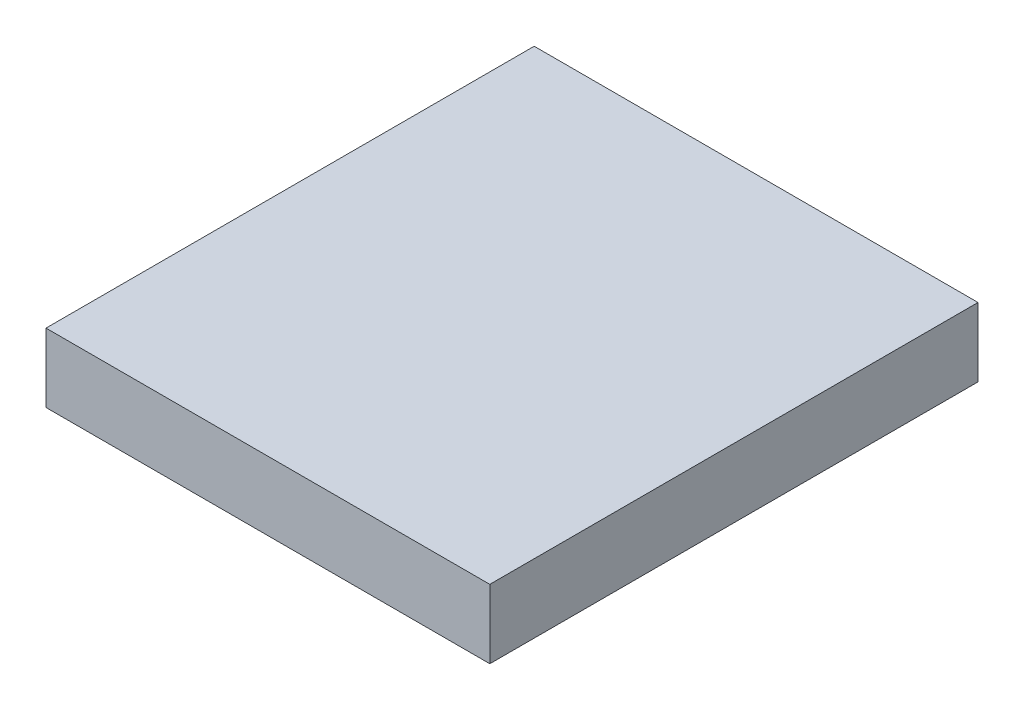
ISO-10303-21;
HEADER;
FILE_DESCRIPTION(('STEP AP214'),'2;1');
FILE_NAME('part.step','',(''),(''),'','','');
FILE_SCHEMA(('AUTOMOTIVE_DESIGN { 1 0 10303 214 1 1 1 1 }'));
ENDSEC;
DATA;
#1=APPLICATION_CONTEXT('core data for automotive mechanical design processes');
#2=APPLICATION_PROTOCOL_DEFINITION('international standard','automotive_design',2000,#1);
#3=PRODUCT_CONTEXT('',#1,'mechanical');
#4=PRODUCT('Part','Part','',(#3));
#5=PRODUCT_RELATED_PRODUCT_CATEGORY('part','',(#4));
#6=PRODUCT_DEFINITION_FORMATION('','',#4);
#7=PRODUCT_DEFINITION_CONTEXT('part definition',#1,'design');
#8=PRODUCT_DEFINITION('design','',#6,#7);
#9=PRODUCT_DEFINITION_SHAPE('','',#8);
#10=(LENGTH_UNIT() NAMED_UNIT(*) SI_UNIT(.MILLI.,.METRE.));
#11=(NAMED_UNIT(*) PLANE_ANGLE_UNIT() SI_UNIT($,.RADIAN.));
#12=(NAMED_UNIT(*) SI_UNIT($,.STERADIAN.) SOLID_ANGLE_UNIT());
#13=UNCERTAINTY_MEASURE_WITH_UNIT(LENGTH_MEASURE(1.E-05),#10,'distance_accuracy_value','');
#14=(GEOMETRIC_REPRESENTATION_CONTEXT(3) GLOBAL_UNCERTAINTY_ASSIGNED_CONTEXT((#13)) GLOBAL_UNIT_ASSIGNED_CONTEXT((#10,
#11,#12)) REPRESENTATION_CONTEXT('',''));
#15=CARTESIAN_POINT('',(0.,0.,0.));
#16=DIRECTION('',(0.,0.,1.));
#17=DIRECTION('',(1.,0.,0.));
#18=AXIS2_PLACEMENT_3D('',#15,#16,#17);
#19=CARTESIAN_POINT('',(-50.,15.5,55.));
#20=DIRECTION('',(1.,0.,0.));
#21=DIRECTION('',(0.,0.,-1.));
#22=AXIS2_PLACEMENT_3D('',#19,#20,#21);
#23=PLANE('',#22);
#24=DIRECTION('',(0.,0.,1.));
#25=VECTOR('',#24,1.);
#26=CARTESIAN_POINT('',(-50.,0.,55.));
#27=LINE('',#26,#25);
#28=CARTESIAN_POINT('',(-50.,0.,-55.));
#29=VERTEX_POINT('',#28);
#30=CARTESIAN_POINT('',(-50.,0.,55.));
#31=VERTEX_POINT('',#30);
#32=EDGE_CURVE('E115',#29,#31,#27,.T.);
#33=ORIENTED_EDGE('',*,*,#32,.T.);
#34=DIRECTION('',(0.,-1.,0.));
#35=VECTOR('',#34,1.);
#36=CARTESIAN_POINT('',(-50.,15.5,55.));
#37=LINE('',#36,#35);
#38=CARTESIAN_POINT('',(-50.,15.5,55.));
#39=VERTEX_POINT('',#38);
#40=EDGE_CURVE('E11',#39,#31,#37,.T.);
#41=ORIENTED_EDGE('',*,*,#40,.F.);
#42=DIRECTION('',(0.,0.,1.));
#43=VECTOR('',#42,1.);
#44=CARTESIAN_POINT('',(-50.,15.5,55.));
#45=LINE('',#44,#43);
#46=CARTESIAN_POINT('',(-50.,15.5,-55.));
#47=VERTEX_POINT('',#46);
#48=EDGE_CURVE('E92',#47,#39,#45,.T.);
#49=ORIENTED_EDGE('',*,*,#48,.F.);
#50=DIRECTION('',(0.,-1.,0.));
#51=VECTOR('',#50,1.);
#52=CARTESIAN_POINT('',(-50.,15.5,-55.));
#53=LINE('',#52,#51);
#54=EDGE_CURVE('E107',#47,#29,#53,.T.);
#55=ORIENTED_EDGE('',*,*,#54,.T.);
#56=EDGE_LOOP('',(#33,#41,#49,#55));
#57=FACE_BOUND('',#56,.T.);
#58=ADVANCED_FACE('F43',(#57),#23,.F.);
#59=CARTESIAN_POINT('',(-50.,15.5,55.));
#60=DIRECTION('',(0.,0.,-1.));
#61=DIRECTION('',(-1.,0.,0.));
#62=AXIS2_PLACEMENT_3D('',#59,#60,#61);
#63=PLANE('',#62);
#64=DIRECTION('',(1.,0.,0.));
#65=VECTOR('',#64,1.);
#66=CARTESIAN_POINT('',(-50.,0.,55.));
#67=LINE('',#66,#65);
#68=CARTESIAN_POINT('',(50.,0.,55.));
#69=VERTEX_POINT('',#68);
#70=EDGE_CURVE('E99',#31,#69,#67,.T.);
#71=ORIENTED_EDGE('',*,*,#70,.T.);
#72=DIRECTION('',(0.,-1.,0.));
#73=VECTOR('',#72,1.);
#74=CARTESIAN_POINT('',(50.,15.5,55.));
#75=LINE('',#74,#73);
#76=CARTESIAN_POINT('',(50.,15.5,55.));
#77=VERTEX_POINT('',#76);
#78=EDGE_CURVE('E55',#77,#69,#75,.T.);
#79=ORIENTED_EDGE('',*,*,#78,.F.);
#80=DIRECTION('',(1.,0.,0.));
#81=VECTOR('',#80,1.);
#82=CARTESIAN_POINT('',(-50.,15.5,55.));
#83=LINE('',#82,#81);
#84=EDGE_CURVE('E89',#39,#77,#83,.T.);
#85=ORIENTED_EDGE('',*,*,#84,.F.);
#86=ORIENTED_EDGE('',*,*,#40,.T.);
#87=EDGE_LOOP('',(#71,#79,#85,#86));
#88=FACE_BOUND('',#87,.T.);
#89=ADVANCED_FACE('F97',(#88),#63,.F.);
#90=CARTESIAN_POINT('',(50.,15.5,55.));
#91=DIRECTION('',(-1.,0.,0.));
#92=DIRECTION('',(0.,0.,1.));
#93=AXIS2_PLACEMENT_3D('',#90,#91,#92);
#94=PLANE('',#93);
#95=DIRECTION('',(0.,0.,-1.));
#96=VECTOR('',#95,1.);
#97=CARTESIAN_POINT('',(50.,0.,55.));
#98=LINE('',#97,#96);
#99=CARTESIAN_POINT('',(50.,0.,-55.));
#100=VERTEX_POINT('',#99);
#101=EDGE_CURVE('E76',#69,#100,#98,.T.);
#102=ORIENTED_EDGE('',*,*,#101,.T.);
#103=DIRECTION('',(0.,-1.,0.));
#104=VECTOR('',#103,1.);
#105=CARTESIAN_POINT('',(50.,15.5,-55.));
#106=LINE('',#105,#104);
#107=CARTESIAN_POINT('',(50.,15.5,-55.));
#108=VERTEX_POINT('',#107);
#109=EDGE_CURVE('E105',#108,#100,#106,.T.);
#110=ORIENTED_EDGE('',*,*,#109,.F.);
#111=DIRECTION('',(0.,0.,-1.));
#112=VECTOR('',#111,1.);
#113=CARTESIAN_POINT('',(50.,15.5,55.));
#114=LINE('',#113,#112);
#115=EDGE_CURVE('E91',#77,#108,#114,.T.);
#116=ORIENTED_EDGE('',*,*,#115,.F.);
#117=ORIENTED_EDGE('',*,*,#78,.T.);
#118=EDGE_LOOP('',(#102,#110,#116,#117));
#119=FACE_BOUND('',#118,.T.);
#120=ADVANCED_FACE('F103',(#119),#94,.F.);
#121=CARTESIAN_POINT('',(-50.,15.5,-55.));
#122=DIRECTION('',(0.,0.,1.));
#123=DIRECTION('',(1.,0.,0.));
#124=AXIS2_PLACEMENT_3D('',#121,#122,#123);
#125=PLANE('',#124);
#126=DIRECTION('',(-1.,0.,0.));
#127=VECTOR('',#126,1.);
#128=CARTESIAN_POINT('',(-50.,0.,-55.));
#129=LINE('',#128,#127);
#130=EDGE_CURVE('E84',#100,#29,#129,.T.);
#131=ORIENTED_EDGE('',*,*,#130,.T.);
#132=ORIENTED_EDGE('',*,*,#54,.F.);
#133=DIRECTION('',(-1.,0.,0.));
#134=VECTOR('',#133,1.);
#135=CARTESIAN_POINT('',(-50.,15.5,-55.));
#136=LINE('',#135,#134);
#137=EDGE_CURVE('E58',#108,#47,#136,.T.);
#138=ORIENTED_EDGE('',*,*,#137,.F.);
#139=ORIENTED_EDGE('',*,*,#109,.T.);
#140=EDGE_LOOP('',(#131,#132,#138,#139));
#141=FACE_BOUND('',#140,.T.);
#142=ADVANCED_FACE('F125',(#141),#125,.F.);
#143=CARTESIAN_POINT('',(0.,15.5,0.));
#144=DIRECTION('',(0.,-1.,0.));
#145=DIRECTION('',(0.,0.,-1.));
#146=AXIS2_PLACEMENT_3D('',#143,#144,#145);
#147=PLANE('',#146);
#148=ORIENTED_EDGE('',*,*,#48,.T.);
#149=ORIENTED_EDGE('',*,*,#84,.T.);
#150=ORIENTED_EDGE('',*,*,#115,.T.);
#151=ORIENTED_EDGE('',*,*,#137,.T.);
#152=EDGE_LOOP('',(#148,#149,#150,#151));
#153=FACE_BOUND('',#152,.T.);
#154=ADVANCED_FACE('F93',(#153),#147,.F.);
#155=CARTESIAN_POINT('',(0.,0.,0.));
#156=DIRECTION('',(0.,-1.,0.));
#157=DIRECTION('',(0.,0.,-1.));
#158=AXIS2_PLACEMENT_3D('',#155,#156,#157);
#159=PLANE('',#158);
#160=ORIENTED_EDGE('',*,*,#32,.F.);
#161=ORIENTED_EDGE('',*,*,#130,.F.);
#162=ORIENTED_EDGE('',*,*,#101,.F.);
#163=ORIENTED_EDGE('',*,*,#70,.F.);
#164=EDGE_LOOP('',(#160,#161,#162,#163));
#165=FACE_BOUND('',#164,.T.);
#166=ADVANCED_FACE('F126',(#165),#159,.T.);
#167=CLOSED_SHELL('',(#58,#89,#120,#142,#154,#166));
#168=MANIFOLD_SOLID_BREP('B2',#167);
#169=ADVANCED_BREP_SHAPE_REPRESENTATION('',(#18,#168),#14);
#170=SHAPE_DEFINITION_REPRESENTATION(#9,#169);
ENDSEC;
END-ISO-10303-21;
